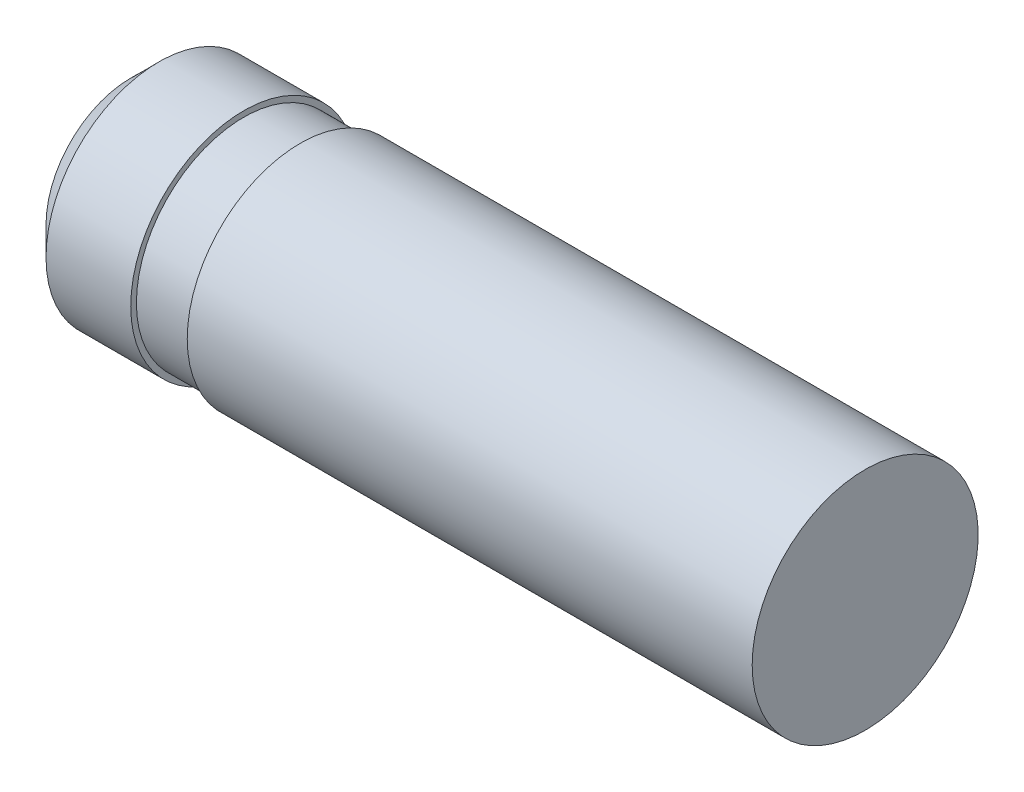
ISO-10303-21;
HEADER;
FILE_DESCRIPTION(('STEP AP214'),'2;1');
FILE_NAME('part.step','',(''),(''),'','','');
FILE_SCHEMA(('AUTOMOTIVE_DESIGN { 1 0 10303 214 1 1 1 1 }'));
ENDSEC;
DATA;
#1=APPLICATION_CONTEXT('core data for automotive mechanical design processes');
#2=APPLICATION_PROTOCOL_DEFINITION('international standard','automotive_design',2000,#1);
#3=PRODUCT_CONTEXT('',#1,'mechanical');
#4=PRODUCT('Part','Part','',(#3));
#5=PRODUCT_RELATED_PRODUCT_CATEGORY('part','',(#4));
#6=PRODUCT_DEFINITION_FORMATION('','',#4);
#7=PRODUCT_DEFINITION_CONTEXT('part definition',#1,'design');
#8=PRODUCT_DEFINITION('design','',#6,#7);
#9=PRODUCT_DEFINITION_SHAPE('','',#8);
#10=(LENGTH_UNIT() NAMED_UNIT(*) SI_UNIT(.MILLI.,.METRE.));
#11=(NAMED_UNIT(*) PLANE_ANGLE_UNIT() SI_UNIT($,.RADIAN.));
#12=(NAMED_UNIT(*) SI_UNIT($,.STERADIAN.) SOLID_ANGLE_UNIT());
#13=UNCERTAINTY_MEASURE_WITH_UNIT(LENGTH_MEASURE(1.E-05),#10,'distance_accuracy_value','');
#14=(GEOMETRIC_REPRESENTATION_CONTEXT(3) GLOBAL_UNCERTAINTY_ASSIGNED_CONTEXT((#13)) GLOBAL_UNIT_ASSIGNED_CONTEXT((#10,
#11,#12)) REPRESENTATION_CONTEXT('',''));
#15=CARTESIAN_POINT('',(0.,0.,0.));
#16=DIRECTION('',(0.,0.,1.));
#17=DIRECTION('',(1.,0.,0.));
#18=AXIS2_PLACEMENT_3D('',#15,#16,#17);
#19=CARTESIAN_POINT('',(4.56382978723404,-2.,0.));
#20=DIRECTION('',(1.,0.,0.));
#21=DIRECTION('',(0.,0.,-1.));
#22=AXIS2_PLACEMENT_3D('',#19,#20,#21);
#23=PLANE('',#22);
#24=CARTESIAN_POINT('',(4.56382978723404,0.,0.));
#25=DIRECTION('',(-1.,0.,0.));
#26=DIRECTION('',(0.,0.,1.));
#27=AXIS2_PLACEMENT_3D('',#24,#25,#26);
#28=CIRCLE('',#27,2.);
#29=CARTESIAN_POINT('',(4.56382978723404,0.,2.));
#30=VERTEX_POINT('',#29);
#31=EDGE_CURVE('E72',#30,#30,#28,.T.);
#32=ORIENTED_EDGE('',*,*,#31,.F.);
#33=EDGE_LOOP('',(#32));
#34=FACE_BOUND('',#33,.T.);
#35=ADVANCED_FACE('F39',(#34),#23,.T.);
#36=CARTESIAN_POINT('',(-8.43617021276596,-2.,0.));
#37=DIRECTION('',(-1.,0.,0.));
#38=DIRECTION('',(0.,0.,1.));
#39=AXIS2_PLACEMENT_3D('',#36,#37,#38);
#40=PLANE('',#39);
#41=CARTESIAN_POINT('',(-8.43617021276596,0.,0.));
#42=DIRECTION('',(-1.,0.,0.));
#43=DIRECTION('',(0.,0.,1.));
#44=AXIS2_PLACEMENT_3D('',#41,#42,#43);
#45=CIRCLE('',#44,1.5);
#46=CARTESIAN_POINT('',(-8.43617021276596,0.,1.5));
#47=VERTEX_POINT('',#46);
#48=EDGE_CURVE('E48',#47,#47,#45,.T.);
#49=ORIENTED_EDGE('',*,*,#48,.T.);
#50=EDGE_LOOP('',(#49));
#51=FACE_BOUND('',#50,.T.);
#52=ADVANCED_FACE('F81',(#51),#40,.T.);
#53=CARTESIAN_POINT('',(-11.4441489361702,0.,0.));
#54=DIRECTION('',(-1.,0.,0.));
#55=DIRECTION('',(0.,0.,1.));
#56=AXIS2_PLACEMENT_3D('',#53,#54,#55);
#57=CYLINDRICAL_SURFACE('',#56,2.);
#58=CARTESIAN_POINT('',(-7.93617021276596,0.,0.));
#59=DIRECTION('',(-1.,0.,0.));
#60=DIRECTION('',(0.,0.,1.));
#61=AXIS2_PLACEMENT_3D('',#58,#59,#60);
#62=CIRCLE('',#61,2.);
#63=CARTESIAN_POINT('',(-7.93617021276596,0.,2.));
#64=VERTEX_POINT('',#63);
#65=EDGE_CURVE('E10',#64,#64,#62,.F.);
#66=ORIENTED_EDGE('',*,*,#65,.T.);
#67=EDGE_LOOP('',(#66));
#68=FACE_BOUND('',#67,.T.);
#69=CARTESIAN_POINT('',(-6.43617021276596,0.,0.));
#70=DIRECTION('',(-1.,0.,0.));
#71=DIRECTION('',(0.,0.,1.));
#72=AXIS2_PLACEMENT_3D('',#69,#70,#71);
#73=CIRCLE('',#72,2.);
#74=CARTESIAN_POINT('',(-6.43617021276596,0.,2.));
#75=VERTEX_POINT('',#74);
#76=EDGE_CURVE('E53',#75,#75,#73,.T.);
#77=ORIENTED_EDGE('',*,*,#76,.T.);
#78=EDGE_LOOP('',(#77));
#79=FACE_BOUND('',#78,.T.);
#80=ADVANCED_FACE('F85',(#68,#79),#57,.T.);
#81=CARTESIAN_POINT('',(-6.43617021276596,-1.9,0.));
#82=DIRECTION('',(1.,0.,0.));
#83=DIRECTION('',(0.,0.,-1.));
#84=AXIS2_PLACEMENT_3D('',#81,#82,#83);
#85=PLANE('',#84);
#86=CARTESIAN_POINT('',(-6.43617021276596,0.,0.));
#87=DIRECTION('',(-1.,0.,0.));
#88=DIRECTION('',(0.,0.,1.));
#89=AXIS2_PLACEMENT_3D('',#86,#87,#88);
#90=CIRCLE('',#89,1.9);
#91=CARTESIAN_POINT('',(-6.43617021276596,0.,1.9));
#92=VERTEX_POINT('',#91);
#93=EDGE_CURVE('E58',#92,#92,#90,.T.);
#94=ORIENTED_EDGE('',*,*,#93,.T.);
#95=EDGE_LOOP('',(#94));
#96=FACE_BOUND('',#95,.T.);
#97=ORIENTED_EDGE('',*,*,#76,.F.);
#98=EDGE_LOOP('',(#97));
#99=FACE_BOUND('',#98,.T.);
#100=ADVANCED_FACE('F90',(#96,#99),#85,.T.);
#101=CARTESIAN_POINT('',(-11.4441489361702,0.,0.));
#102=DIRECTION('',(-1.,0.,0.));
#103=DIRECTION('',(0.,0.,1.));
#104=AXIS2_PLACEMENT_3D('',#101,#102,#103);
#105=CYLINDRICAL_SURFACE('',#104,1.9);
#106=CARTESIAN_POINT('',(-5.43617021276596,0.,0.));
#107=DIRECTION('',(-1.,0.,0.));
#108=DIRECTION('',(0.,0.,1.));
#109=AXIS2_PLACEMENT_3D('',#106,#107,#108);
#110=CIRCLE('',#109,1.9);
#111=CARTESIAN_POINT('',(-5.43617021276596,0.,1.9));
#112=VERTEX_POINT('',#111);
#113=EDGE_CURVE('E64',#112,#112,#110,.T.);
#114=ORIENTED_EDGE('',*,*,#113,.T.);
#115=EDGE_LOOP('',(#114));
#116=FACE_BOUND('',#115,.T.);
#117=ORIENTED_EDGE('',*,*,#93,.F.);
#118=EDGE_LOOP('',(#117));
#119=FACE_BOUND('',#118,.T.);
#120=ADVANCED_FACE('F93',(#116,#119),#105,.T.);
#121=CARTESIAN_POINT('',(-5.43617021276596,-2.,0.));
#122=DIRECTION('',(-1.,0.,0.));
#123=DIRECTION('',(0.,0.,1.));
#124=AXIS2_PLACEMENT_3D('',#121,#122,#123);
#125=PLANE('',#124);
#126=CARTESIAN_POINT('',(-5.43617021276596,0.,0.));
#127=DIRECTION('',(-1.,0.,0.));
#128=DIRECTION('',(0.,0.,1.));
#129=AXIS2_PLACEMENT_3D('',#126,#127,#128);
#130=CIRCLE('',#129,2.);
#131=CARTESIAN_POINT('',(-5.43617021276596,0.,2.));
#132=VERTEX_POINT('',#131);
#133=EDGE_CURVE('E68',#132,#132,#130,.T.);
#134=ORIENTED_EDGE('',*,*,#133,.T.);
#135=EDGE_LOOP('',(#134));
#136=FACE_BOUND('',#135,.T.);
#137=ORIENTED_EDGE('',*,*,#113,.F.);
#138=EDGE_LOOP('',(#137));
#139=FACE_BOUND('',#138,.T.);
#140=ADVANCED_FACE('F97',(#136,#139),#125,.T.);
#141=CARTESIAN_POINT('',(-11.4441489361702,0.,0.));
#142=DIRECTION('',(-1.,0.,0.));
#143=DIRECTION('',(0.,0.,1.));
#144=AXIS2_PLACEMENT_3D('',#141,#142,#143);
#145=CYLINDRICAL_SURFACE('',#144,2.);
#146=ORIENTED_EDGE('',*,*,#31,.T.);
#147=EDGE_LOOP('',(#146));
#148=FACE_BOUND('',#147,.T.);
#149=ORIENTED_EDGE('',*,*,#133,.F.);
#150=EDGE_LOOP('',(#149));
#151=FACE_BOUND('',#150,.T.);
#152=ADVANCED_FACE('F77',(#148,#151),#145,.T.);
#153=CARTESIAN_POINT('',(-8.43617021276596,0.,0.));
#154=DIRECTION('',(1.,0.,0.));
#155=DIRECTION('',(0.,0.,-1.));
#156=AXIS2_PLACEMENT_3D('',#153,#154,#155);
#157=CONICAL_SURFACE('',#156,1.5,0.785398163397447);
#158=ORIENTED_EDGE('',*,*,#65,.F.);
#159=EDGE_LOOP('',(#158));
#160=FACE_BOUND('',#159,.T.);
#161=ORIENTED_EDGE('',*,*,#48,.F.);
#162=EDGE_LOOP('',(#161));
#163=FACE_BOUND('',#162,.T.);
#164=ADVANCED_FACE('F42',(#160,#163),#157,.T.);
#165=CLOSED_SHELL('',(#35,#52,#80,#100,#120,#140,#152,#164));
#166=MANIFOLD_SOLID_BREP('B2',#165);
#167=ADVANCED_BREP_SHAPE_REPRESENTATION('',(#18,#166),#14);
#168=SHAPE_DEFINITION_REPRESENTATION(#9,#167);
ENDSEC;
END-ISO-10303-21;
